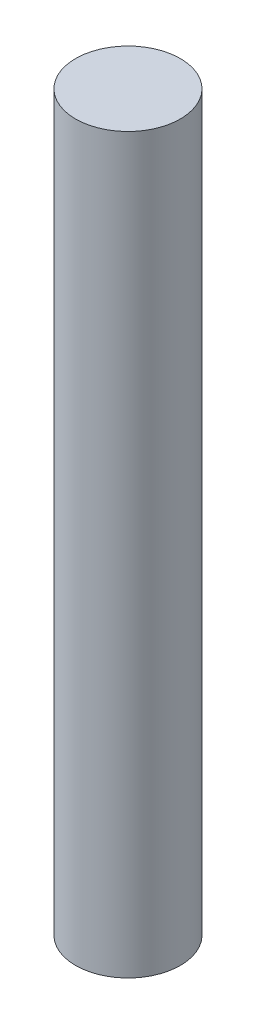
ISO-10303-21;
HEADER;
FILE_DESCRIPTION(('STEP AP214'),'2;1');
FILE_NAME('part.step','',(''),(''),'','','');
FILE_SCHEMA(('AUTOMOTIVE_DESIGN { 1 0 10303 214 1 1 1 1 }'));
ENDSEC;
DATA;
#1=APPLICATION_CONTEXT('core data for automotive mechanical design processes');
#2=APPLICATION_PROTOCOL_DEFINITION('international standard','automotive_design',2000,#1);
#3=PRODUCT_CONTEXT('',#1,'mechanical');
#4=PRODUCT('Part','Part','',(#3));
#5=PRODUCT_RELATED_PRODUCT_CATEGORY('part','',(#4));
#6=PRODUCT_DEFINITION_FORMATION('','',#4);
#7=PRODUCT_DEFINITION_CONTEXT('part definition',#1,'design');
#8=PRODUCT_DEFINITION('design','',#6,#7);
#9=PRODUCT_DEFINITION_SHAPE('','',#8);
#10=(LENGTH_UNIT() NAMED_UNIT(*) SI_UNIT(.MILLI.,.METRE.));
#11=(NAMED_UNIT(*) PLANE_ANGLE_UNIT() SI_UNIT($,.RADIAN.));
#12=(NAMED_UNIT(*) SI_UNIT($,.STERADIAN.) SOLID_ANGLE_UNIT());
#13=UNCERTAINTY_MEASURE_WITH_UNIT(LENGTH_MEASURE(1.E-05),#10,'distance_accuracy_value','');
#14=(GEOMETRIC_REPRESENTATION_CONTEXT(3) GLOBAL_UNCERTAINTY_ASSIGNED_CONTEXT((#13)) GLOBAL_UNIT_ASSIGNED_CONTEXT((#10,
#11,#12)) REPRESENTATION_CONTEXT('',''));
#15=CARTESIAN_POINT('',(0.,0.,0.));
#16=DIRECTION('',(0.,0.,1.));
#17=DIRECTION('',(1.,0.,0.));
#18=AXIS2_PLACEMENT_3D('',#15,#16,#17);
#19=CARTESIAN_POINT('',(0.,56.,0.));
#20=DIRECTION('',(0.,-1.,0.));
#21=DIRECTION('',(0.,0.,-1.));
#22=AXIS2_PLACEMENT_3D('',#19,#20,#21);
#23=CYLINDRICAL_SURFACE('',#22,4.);
#24=CARTESIAN_POINT('',(0.,56.,0.));
#25=DIRECTION('',(0.,1.,0.));
#26=DIRECTION('',(0.,0.,1.));
#27=AXIS2_PLACEMENT_3D('',#24,#25,#26);
#28=CIRCLE('',#27,4.);
#29=CARTESIAN_POINT('',(0.,56.,4.));
#30=VERTEX_POINT('',#29);
#31=EDGE_CURVE('E10',#30,#30,#28,.T.);
#32=ORIENTED_EDGE('',*,*,#31,.F.);
#33=EDGE_LOOP('',(#32));
#34=FACE_BOUND('',#33,.T.);
#35=CARTESIAN_POINT('',(0.,0.,0.));
#36=DIRECTION('',(0.,1.,0.));
#37=DIRECTION('',(0.,0.,1.));
#38=AXIS2_PLACEMENT_3D('',#35,#36,#37);
#39=CIRCLE('',#38,4.);
#40=CARTESIAN_POINT('',(0.,0.,4.));
#41=VERTEX_POINT('',#40);
#42=EDGE_CURVE('E40',#41,#41,#39,.T.);
#43=ORIENTED_EDGE('',*,*,#42,.T.);
#44=EDGE_LOOP('',(#43));
#45=FACE_BOUND('',#44,.T.);
#46=ADVANCED_FACE('F37',(#34,#45),#23,.T.);
#47=CARTESIAN_POINT('',(0.,56.,0.));
#48=DIRECTION('',(0.,1.,0.));
#49=DIRECTION('',(0.,0.,1.));
#50=AXIS2_PLACEMENT_3D('',#47,#48,#49);
#51=PLANE('',#50);
#52=ORIENTED_EDGE('',*,*,#31,.T.);
#53=EDGE_LOOP('',(#52));
#54=FACE_BOUND('',#53,.T.);
#55=ADVANCED_FACE('F54',(#54),#51,.T.);
#56=CARTESIAN_POINT('',(0.,0.,0.));
#57=DIRECTION('',(0.,1.,0.));
#58=DIRECTION('',(0.,0.,1.));
#59=AXIS2_PLACEMENT_3D('',#56,#57,#58);
#60=PLANE('',#59);
#61=ORIENTED_EDGE('',*,*,#42,.F.);
#62=EDGE_LOOP('',(#61));
#63=FACE_BOUND('',#62,.T.);
#64=ADVANCED_FACE('F52',(#63),#60,.F.);
#65=CLOSED_SHELL('',(#46,#55,#64));
#66=MANIFOLD_SOLID_BREP('B2',#65);
#67=ADVANCED_BREP_SHAPE_REPRESENTATION('',(#18,#66),#14);
#68=SHAPE_DEFINITION_REPRESENTATION(#9,#67);
ENDSEC;
END-ISO-10303-21;
